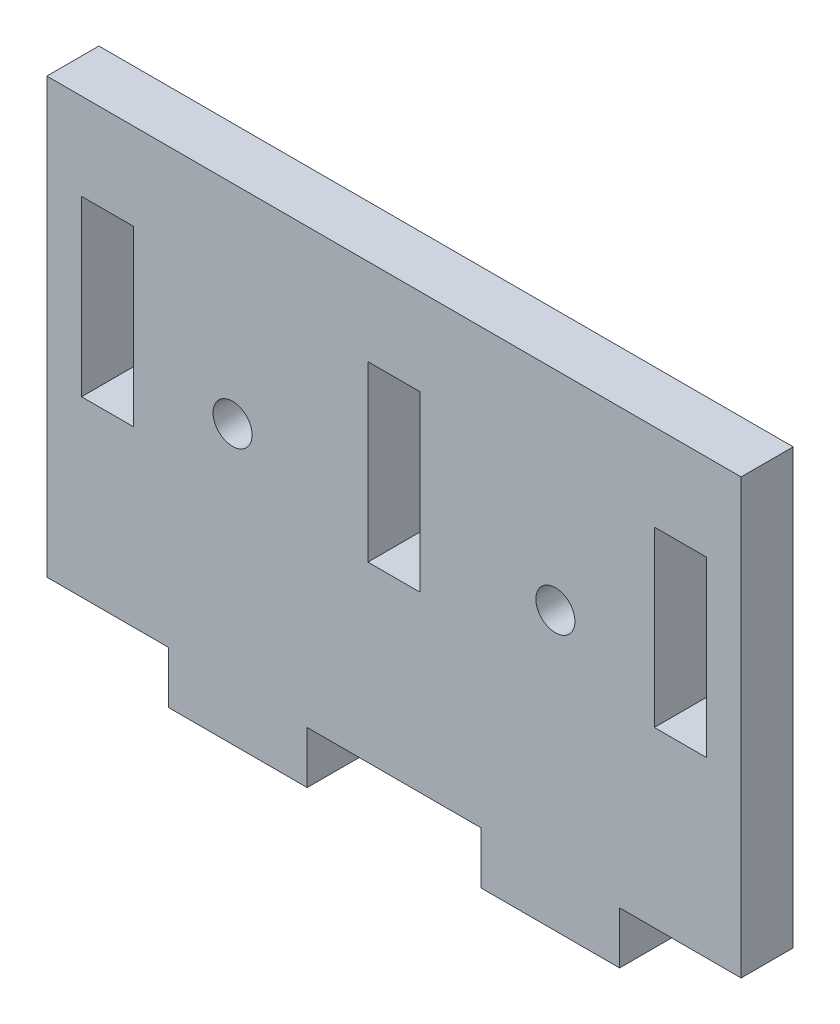
ISO-10303-21;
HEADER;
FILE_DESCRIPTION(('STEP AP214'),'2;1');
FILE_NAME('part.step','',(''),(''),'','','');
FILE_SCHEMA(('AUTOMOTIVE_DESIGN { 1 0 10303 214 1 1 1 1 }'));
ENDSEC;
DATA;
#1=APPLICATION_CONTEXT('core data for automotive mechanical design processes');
#2=APPLICATION_PROTOCOL_DEFINITION('international standard','automotive_design',2000,#1);
#3=PRODUCT_CONTEXT('',#1,'mechanical');
#4=PRODUCT('Part','Part','',(#3));
#5=PRODUCT_RELATED_PRODUCT_CATEGORY('part','',(#4));
#6=PRODUCT_DEFINITION_FORMATION('','',#4);
#7=PRODUCT_DEFINITION_CONTEXT('part definition',#1,'design');
#8=PRODUCT_DEFINITION('design','',#6,#7);
#9=PRODUCT_DEFINITION_SHAPE('','',#8);
#10=(LENGTH_UNIT() NAMED_UNIT(*) SI_UNIT(.MILLI.,.METRE.));
#11=(NAMED_UNIT(*) PLANE_ANGLE_UNIT() SI_UNIT($,.RADIAN.));
#12=(NAMED_UNIT(*) SI_UNIT($,.STERADIAN.) SOLID_ANGLE_UNIT());
#13=UNCERTAINTY_MEASURE_WITH_UNIT(LENGTH_MEASURE(1.E-05),#10,'distance_accuracy_value','');
#14=(GEOMETRIC_REPRESENTATION_CONTEXT(3) GLOBAL_UNCERTAINTY_ASSIGNED_CONTEXT((#13)) GLOBAL_UNIT_ASSIGNED_CONTEXT((#10,
#11,#12)) REPRESENTATION_CONTEXT('',''));
#15=CARTESIAN_POINT('',(0.,0.,0.));
#16=DIRECTION('',(0.,0.,1.));
#17=DIRECTION('',(1.,0.,0.));
#18=AXIS2_PLACEMENT_3D('',#15,#16,#17);
#19=CARTESIAN_POINT('',(0.,1.38777878078145E-13,3.));
#20=DIRECTION('',(0.,-1.,0.));
#21=DIRECTION('',(1.,0.,0.));
#22=AXIS2_PLACEMENT_3D('',#19,#20,#21);
#23=PLANE('',#22);
#24=DIRECTION('',(-1.,0.,0.));
#25=VECTOR('',#24,1.);
#26=CARTESIAN_POINT('',(0.,1.38777878078145E-13,0.));
#27=LINE('',#26,#25);
#28=CARTESIAN_POINT('',(40.,0.,0.));
#29=VERTEX_POINT('',#28);
#30=CARTESIAN_POINT('',(33.,0.,0.));
#31=VERTEX_POINT('',#30);
#32=EDGE_CURVE('E274',#29,#31,#27,.T.);
#33=ORIENTED_EDGE('',*,*,#32,.F.);
#34=DIRECTION('',(0.,0.,-1.));
#35=VECTOR('',#34,1.);
#36=CARTESIAN_POINT('',(40.,0.,3.));
#37=LINE('',#36,#35);
#38=CARTESIAN_POINT('',(40.,0.,3.));
#39=VERTEX_POINT('',#38);
#40=EDGE_CURVE('E11',#39,#29,#37,.T.);
#41=ORIENTED_EDGE('',*,*,#40,.F.);
#42=DIRECTION('',(-1.,0.,0.));
#43=VECTOR('',#42,1.);
#44=CARTESIAN_POINT('',(0.,1.38777878078145E-13,3.));
#45=LINE('',#44,#43);
#46=CARTESIAN_POINT('',(33.,0.,3.));
#47=VERTEX_POINT('',#46);
#48=EDGE_CURVE('E496',#39,#47,#45,.T.);
#49=ORIENTED_EDGE('',*,*,#48,.T.);
#50=DIRECTION('',(0.,0.,-1.));
#51=VECTOR('',#50,1.);
#52=CARTESIAN_POINT('',(33.,0.,3.));
#53=LINE('',#52,#51);
#54=EDGE_CURVE('E55',#47,#31,#53,.T.);
#55=ORIENTED_EDGE('',*,*,#54,.T.);
#56=EDGE_LOOP('',(#33,#41,#49,#55));
#57=FACE_BOUND('',#56,.T.);
#58=ADVANCED_FACE('F36',(#57),#23,.T.);
#59=CARTESIAN_POINT('',(40.,0.,3.));
#60=DIRECTION('',(-1.,0.,0.));
#61=DIRECTION('',(0.,-1.,0.));
#62=AXIS2_PLACEMENT_3D('',#59,#60,#61);
#63=PLANE('',#62);
#64=DIRECTION('',(0.,1.,0.));
#65=VECTOR('',#64,1.);
#66=CARTESIAN_POINT('',(40.,0.,0.));
#67=LINE('',#66,#65);
#68=CARTESIAN_POINT('',(40.,25.,0.));
#69=VERTEX_POINT('',#68);
#70=EDGE_CURVE('E276',#29,#69,#67,.T.);
#71=ORIENTED_EDGE('',*,*,#70,.T.);
#72=DIRECTION('',(0.,0.,-1.));
#73=VECTOR('',#72,1.);
#74=CARTESIAN_POINT('',(40.,25.,3.));
#75=LINE('',#74,#73);
#76=CARTESIAN_POINT('',(40.,25.,3.));
#77=VERTEX_POINT('',#76);
#78=EDGE_CURVE('E46',#77,#69,#75,.T.);
#79=ORIENTED_EDGE('',*,*,#78,.F.);
#80=DIRECTION('',(0.,1.,0.));
#81=VECTOR('',#80,1.);
#82=CARTESIAN_POINT('',(40.,0.,3.));
#83=LINE('',#82,#81);
#84=EDGE_CURVE('E494',#39,#77,#83,.T.);
#85=ORIENTED_EDGE('',*,*,#84,.F.);
#86=ORIENTED_EDGE('',*,*,#40,.T.);
#87=EDGE_LOOP('',(#71,#79,#85,#86));
#88=FACE_BOUND('',#87,.T.);
#89=ADVANCED_FACE('F389',(#88),#63,.F.);
#90=CARTESIAN_POINT('',(0.,25.,3.));
#91=DIRECTION('',(0.,-1.,0.));
#92=DIRECTION('',(1.,0.,0.));
#93=AXIS2_PLACEMENT_3D('',#90,#91,#92);
#94=PLANE('',#93);
#95=DIRECTION('',(-1.,0.,0.));
#96=VECTOR('',#95,1.);
#97=CARTESIAN_POINT('',(0.,25.,0.));
#98=LINE('',#97,#96);
#99=CARTESIAN_POINT('',(0.,25.,0.));
#100=VERTEX_POINT('',#99);
#101=EDGE_CURVE('E279',#69,#100,#98,.T.);
#102=ORIENTED_EDGE('',*,*,#101,.T.);
#103=DIRECTION('',(0.,0.,-1.));
#104=VECTOR('',#103,1.);
#105=CARTESIAN_POINT('',(0.,25.,3.));
#106=LINE('',#105,#104);
#107=CARTESIAN_POINT('',(0.,25.,3.));
#108=VERTEX_POINT('',#107);
#109=EDGE_CURVE('E332',#108,#100,#106,.T.);
#110=ORIENTED_EDGE('',*,*,#109,.F.);
#111=DIRECTION('',(-1.,0.,0.));
#112=VECTOR('',#111,1.);
#113=CARTESIAN_POINT('',(0.,25.,3.));
#114=LINE('',#113,#112);
#115=EDGE_CURVE('E490',#77,#108,#114,.T.);
#116=ORIENTED_EDGE('',*,*,#115,.F.);
#117=ORIENTED_EDGE('',*,*,#78,.T.);
#118=EDGE_LOOP('',(#102,#110,#116,#117));
#119=FACE_BOUND('',#118,.T.);
#120=ADVANCED_FACE('F394',(#119),#94,.F.);
#121=CARTESIAN_POINT('',(0.,0.,3.));
#122=DIRECTION('',(1.,0.,0.));
#123=DIRECTION('',(0.,1.,0.));
#124=AXIS2_PLACEMENT_3D('',#121,#122,#123);
#125=PLANE('',#124);
#126=DIRECTION('',(0.,-1.,0.));
#127=VECTOR('',#126,1.);
#128=CARTESIAN_POINT('',(0.,0.,0.));
#129=LINE('',#128,#127);
#130=CARTESIAN_POINT('',(0.,0.,0.));
#131=VERTEX_POINT('',#130);
#132=EDGE_CURVE('E282',#100,#131,#129,.T.);
#133=ORIENTED_EDGE('',*,*,#132,.T.);
#134=DIRECTION('',(0.,0.,-1.));
#135=VECTOR('',#134,1.);
#136=CARTESIAN_POINT('',(0.,0.,3.));
#137=LINE('',#136,#135);
#138=CARTESIAN_POINT('',(0.,0.,3.));
#139=VERTEX_POINT('',#138);
#140=EDGE_CURVE('E329',#139,#131,#137,.T.);
#141=ORIENTED_EDGE('',*,*,#140,.F.);
#142=DIRECTION('',(0.,-1.,0.));
#143=VECTOR('',#142,1.);
#144=CARTESIAN_POINT('',(0.,0.,3.));
#145=LINE('',#144,#143);
#146=EDGE_CURVE('E486',#108,#139,#145,.T.);
#147=ORIENTED_EDGE('',*,*,#146,.F.);
#148=ORIENTED_EDGE('',*,*,#109,.T.);
#149=EDGE_LOOP('',(#133,#141,#147,#148));
#150=FACE_BOUND('',#149,.T.);
#151=ADVANCED_FACE('F471',(#150),#125,.F.);
#152=CARTESIAN_POINT('',(0.,0.,3.));
#153=DIRECTION('',(0.,1.,0.));
#154=DIRECTION('',(0.,0.,1.));
#155=AXIS2_PLACEMENT_3D('',#152,#153,#154);
#156=PLANE('',#155);
#157=DIRECTION('',(1.,0.,0.));
#158=VECTOR('',#157,1.);
#159=CARTESIAN_POINT('',(0.,0.,0.));
#160=LINE('',#159,#158);
#161=CARTESIAN_POINT('',(7.,0.,0.));
#162=VERTEX_POINT('',#161);
#163=EDGE_CURVE('E285',#131,#162,#160,.T.);
#164=ORIENTED_EDGE('',*,*,#163,.T.);
#165=DIRECTION('',(0.,0.,-1.));
#166=VECTOR('',#165,1.);
#167=CARTESIAN_POINT('',(7.,0.,3.));
#168=LINE('',#167,#166);
#169=CARTESIAN_POINT('',(7.,0.,3.));
#170=VERTEX_POINT('',#169);
#171=EDGE_CURVE('E326',#170,#162,#168,.T.);
#172=ORIENTED_EDGE('',*,*,#171,.F.);
#173=DIRECTION('',(1.,0.,0.));
#174=VECTOR('',#173,1.);
#175=CARTESIAN_POINT('',(0.,0.,3.));
#176=LINE('',#175,#174);
#177=EDGE_CURVE('E489',#139,#170,#176,.T.);
#178=ORIENTED_EDGE('',*,*,#177,.F.);
#179=ORIENTED_EDGE('',*,*,#140,.T.);
#180=EDGE_LOOP('',(#164,#172,#178,#179));
#181=FACE_BOUND('',#180,.T.);
#182=ADVANCED_FACE('F467',(#181),#156,.F.);
#183=CARTESIAN_POINT('',(7.,0.,3.));
#184=DIRECTION('',(1.,0.,0.));
#185=DIRECTION('',(0.,0.,-1.));
#186=AXIS2_PLACEMENT_3D('',#183,#184,#185);
#187=PLANE('',#186);
#188=DIRECTION('',(0.,-1.,0.));
#189=VECTOR('',#188,1.);
#190=CARTESIAN_POINT('',(7.,0.,0.));
#191=LINE('',#190,#189);
#192=CARTESIAN_POINT('',(7.,-3.,0.));
#193=VERTEX_POINT('',#192);
#194=EDGE_CURVE('E288',#162,#193,#191,.T.);
#195=ORIENTED_EDGE('',*,*,#194,.T.);
#196=DIRECTION('',(0.,0.,-1.));
#197=VECTOR('',#196,1.);
#198=CARTESIAN_POINT('',(7.,-3.,3.));
#199=LINE('',#198,#197);
#200=CARTESIAN_POINT('',(7.,-3.,3.));
#201=VERTEX_POINT('',#200);
#202=EDGE_CURVE('E323',#201,#193,#199,.T.);
#203=ORIENTED_EDGE('',*,*,#202,.F.);
#204=DIRECTION('',(0.,-1.,0.));
#205=VECTOR('',#204,1.);
#206=CARTESIAN_POINT('',(7.,0.,3.));
#207=LINE('',#206,#205);
#208=EDGE_CURVE('E501',#170,#201,#207,.T.);
#209=ORIENTED_EDGE('',*,*,#208,.F.);
#210=ORIENTED_EDGE('',*,*,#171,.T.);
#211=EDGE_LOOP('',(#195,#203,#209,#210));
#212=FACE_BOUND('',#211,.T.);
#213=ADVANCED_FACE('F463',(#212),#187,.F.);
#214=CARTESIAN_POINT('',(0.,-3.,3.));
#215=DIRECTION('',(0.,1.,0.));
#216=DIRECTION('',(0.,0.,1.));
#217=AXIS2_PLACEMENT_3D('',#214,#215,#216);
#218=PLANE('',#217);
#219=DIRECTION('',(1.,0.,0.));
#220=VECTOR('',#219,1.);
#221=CARTESIAN_POINT('',(0.,-3.,0.));
#222=LINE('',#221,#220);
#223=CARTESIAN_POINT('',(15.,-3.,0.));
#224=VERTEX_POINT('',#223);
#225=EDGE_CURVE('E291',#193,#224,#222,.T.);
#226=ORIENTED_EDGE('',*,*,#225,.T.);
#227=DIRECTION('',(0.,0.,-1.));
#228=VECTOR('',#227,1.);
#229=CARTESIAN_POINT('',(15.,-3.,3.));
#230=LINE('',#229,#228);
#231=CARTESIAN_POINT('',(15.,-3.,3.));
#232=VERTEX_POINT('',#231);
#233=EDGE_CURVE('E320',#232,#224,#230,.T.);
#234=ORIENTED_EDGE('',*,*,#233,.F.);
#235=DIRECTION('',(1.,0.,0.));
#236=VECTOR('',#235,1.);
#237=CARTESIAN_POINT('',(0.,-3.,3.));
#238=LINE('',#237,#236);
#239=EDGE_CURVE('E504',#201,#232,#238,.T.);
#240=ORIENTED_EDGE('',*,*,#239,.F.);
#241=ORIENTED_EDGE('',*,*,#202,.T.);
#242=EDGE_LOOP('',(#226,#234,#240,#241));
#243=FACE_BOUND('',#242,.T.);
#244=ADVANCED_FACE('F459',(#243),#218,.F.);
#245=CARTESIAN_POINT('',(15.,0.,3.));
#246=DIRECTION('',(-1.,0.,0.));
#247=DIRECTION('',(0.,0.,1.));
#248=AXIS2_PLACEMENT_3D('',#245,#246,#247);
#249=PLANE('',#248);
#250=DIRECTION('',(0.,1.,0.));
#251=VECTOR('',#250,1.);
#252=CARTESIAN_POINT('',(15.,0.,0.));
#253=LINE('',#252,#251);
#254=CARTESIAN_POINT('',(15.,0.,0.));
#255=VERTEX_POINT('',#254);
#256=EDGE_CURVE('E294',#224,#255,#253,.T.);
#257=ORIENTED_EDGE('',*,*,#256,.T.);
#258=DIRECTION('',(0.,0.,-1.));
#259=VECTOR('',#258,1.);
#260=CARTESIAN_POINT('',(15.,0.,3.));
#261=LINE('',#260,#259);
#262=CARTESIAN_POINT('',(15.,0.,3.));
#263=VERTEX_POINT('',#262);
#264=EDGE_CURVE('E317',#263,#255,#261,.T.);
#265=ORIENTED_EDGE('',*,*,#264,.F.);
#266=DIRECTION('',(0.,1.,0.));
#267=VECTOR('',#266,1.);
#268=CARTESIAN_POINT('',(15.,0.,3.));
#269=LINE('',#268,#267);
#270=EDGE_CURVE('E507',#232,#263,#269,.T.);
#271=ORIENTED_EDGE('',*,*,#270,.F.);
#272=ORIENTED_EDGE('',*,*,#233,.T.);
#273=EDGE_LOOP('',(#257,#265,#271,#272));
#274=FACE_BOUND('',#273,.T.);
#275=ADVANCED_FACE('F455',(#274),#249,.F.);
#276=CARTESIAN_POINT('',(0.,0.,3.));
#277=DIRECTION('',(0.,1.,0.));
#278=DIRECTION('',(-1.,0.,0.));
#279=AXIS2_PLACEMENT_3D('',#276,#277,#278);
#280=PLANE('',#279);
#281=DIRECTION('',(1.,0.,0.));
#282=VECTOR('',#281,1.);
#283=CARTESIAN_POINT('',(0.,0.,0.));
#284=LINE('',#283,#282);
#285=CARTESIAN_POINT('',(25.,0.,0.));
#286=VERTEX_POINT('',#285);
#287=EDGE_CURVE('E297',#255,#286,#284,.T.);
#288=ORIENTED_EDGE('',*,*,#287,.T.);
#289=DIRECTION('',(0.,0.,-1.));
#290=VECTOR('',#289,1.);
#291=CARTESIAN_POINT('',(25.,0.,3.));
#292=LINE('',#291,#290);
#293=CARTESIAN_POINT('',(25.,0.,3.));
#294=VERTEX_POINT('',#293);
#295=EDGE_CURVE('E213',#294,#286,#292,.T.);
#296=ORIENTED_EDGE('',*,*,#295,.F.);
#297=DIRECTION('',(1.,0.,0.));
#298=VECTOR('',#297,1.);
#299=CARTESIAN_POINT('',(0.,0.,3.));
#300=LINE('',#299,#298);
#301=EDGE_CURVE('E223',#263,#294,#300,.T.);
#302=ORIENTED_EDGE('',*,*,#301,.F.);
#303=ORIENTED_EDGE('',*,*,#264,.T.);
#304=EDGE_LOOP('',(#288,#296,#302,#303));
#305=FACE_BOUND('',#304,.T.);
#306=ADVANCED_FACE('F452',(#305),#280,.F.);
#307=CARTESIAN_POINT('',(25.,0.,3.));
#308=DIRECTION('',(-1.,0.,0.));
#309=DIRECTION('',(0.,0.,1.));
#310=AXIS2_PLACEMENT_3D('',#307,#308,#309);
#311=PLANE('',#310);
#312=DIRECTION('',(0.,1.,0.));
#313=VECTOR('',#312,1.);
#314=CARTESIAN_POINT('',(25.,0.,0.));
#315=LINE('',#314,#313);
#316=CARTESIAN_POINT('',(25.,-2.99999999999997,0.));
#317=VERTEX_POINT('',#316);
#318=EDGE_CURVE('E209',#317,#286,#315,.T.);
#319=ORIENTED_EDGE('',*,*,#318,.F.);
#320=DIRECTION('',(0.,0.,-1.));
#321=VECTOR('',#320,1.);
#322=CARTESIAN_POINT('',(25.,-2.99999999999997,3.));
#323=LINE('',#322,#321);
#324=CARTESIAN_POINT('',(25.,-2.99999999999997,3.));
#325=VERTEX_POINT('',#324);
#326=EDGE_CURVE('E204',#325,#317,#323,.T.);
#327=ORIENTED_EDGE('',*,*,#326,.F.);
#328=DIRECTION('',(0.,1.,0.));
#329=VECTOR('',#328,1.);
#330=CARTESIAN_POINT('',(25.,0.,3.));
#331=LINE('',#330,#329);
#332=EDGE_CURVE('E207',#325,#294,#331,.T.);
#333=ORIENTED_EDGE('',*,*,#332,.T.);
#334=ORIENTED_EDGE('',*,*,#295,.T.);
#335=EDGE_LOOP('',(#319,#327,#333,#334));
#336=FACE_BOUND('',#335,.T.);
#337=ADVANCED_FACE('F206',(#336),#311,.T.);
#338=CARTESIAN_POINT('',(0.,-2.99999999999997,3.));
#339=DIRECTION('',(0.,-1.,0.));
#340=DIRECTION('',(0.,0.,-1.));
#341=AXIS2_PLACEMENT_3D('',#338,#339,#340);
#342=PLANE('',#341);
#343=DIRECTION('',(-1.,0.,0.));
#344=VECTOR('',#343,1.);
#345=CARTESIAN_POINT('',(0.,-2.99999999999997,0.));
#346=LINE('',#345,#344);
#347=CARTESIAN_POINT('',(33.,-2.99999999999997,0.));
#348=VERTEX_POINT('',#347);
#349=EDGE_CURVE('E301',#348,#317,#346,.T.);
#350=ORIENTED_EDGE('',*,*,#349,.F.);
#351=DIRECTION('',(0.,0.,-1.));
#352=VECTOR('',#351,1.);
#353=CARTESIAN_POINT('',(33.,-2.99999999999997,3.));
#354=LINE('',#353,#352);
#355=CARTESIAN_POINT('',(33.,-2.99999999999997,3.));
#356=VERTEX_POINT('',#355);
#357=EDGE_CURVE('E128',#356,#348,#354,.T.);
#358=ORIENTED_EDGE('',*,*,#357,.F.);
#359=DIRECTION('',(-1.,0.,0.));
#360=VECTOR('',#359,1.);
#361=CARTESIAN_POINT('',(0.,-2.99999999999997,3.));
#362=LINE('',#361,#360);
#363=EDGE_CURVE('E221',#356,#325,#362,.T.);
#364=ORIENTED_EDGE('',*,*,#363,.T.);
#365=ORIENTED_EDGE('',*,*,#326,.T.);
#366=EDGE_LOOP('',(#350,#358,#364,#365));
#367=FACE_BOUND('',#366,.T.);
#368=ADVANCED_FACE('F226',(#367),#342,.T.);
#369=CARTESIAN_POINT('',(0.,20.,3.));
#370=DIRECTION('',(0.,1.,0.));
#371=DIRECTION('',(-1.,0.,0.));
#372=AXIS2_PLACEMENT_3D('',#369,#370,#371);
#373=PLANE('',#372);
#374=DIRECTION('',(1.,0.,0.));
#375=VECTOR('',#374,1.);
#376=CARTESIAN_POINT('',(0.,20.,0.));
#377=LINE('',#376,#375);
#378=CARTESIAN_POINT('',(2.,20.,0.));
#379=VERTEX_POINT('',#378);
#380=CARTESIAN_POINT('',(5.,20.,0.));
#381=VERTEX_POINT('',#380);
#382=EDGE_CURVE('E263',#379,#381,#377,.T.);
#383=ORIENTED_EDGE('',*,*,#382,.T.);
#384=DIRECTION('',(0.,0.,-1.));
#385=VECTOR('',#384,1.);
#386=CARTESIAN_POINT('',(5.,20.,3.));
#387=LINE('',#386,#385);
#388=CARTESIAN_POINT('',(5.,20.,3.));
#389=VERTEX_POINT('',#388);
#390=EDGE_CURVE('E314',#389,#381,#387,.T.);
#391=ORIENTED_EDGE('',*,*,#390,.F.);
#392=DIRECTION('',(1.,0.,0.));
#393=VECTOR('',#392,1.);
#394=CARTESIAN_POINT('',(0.,20.,3.));
#395=LINE('',#394,#393);
#396=CARTESIAN_POINT('',(2.,20.,3.));
#397=VERTEX_POINT('',#396);
#398=EDGE_CURVE('E518',#397,#389,#395,.T.);
#399=ORIENTED_EDGE('',*,*,#398,.F.);
#400=DIRECTION('',(0.,0.,-1.));
#401=VECTOR('',#400,1.);
#402=CARTESIAN_POINT('',(2.,20.,3.));
#403=LINE('',#402,#401);
#404=EDGE_CURVE('E337',#397,#379,#403,.T.);
#405=ORIENTED_EDGE('',*,*,#404,.T.);
#406=EDGE_LOOP('',(#383,#391,#399,#405));
#407=FACE_BOUND('',#406,.T.);
#408=ADVANCED_FACE('F412',(#407),#373,.F.);
#409=CARTESIAN_POINT('',(5.,0.,3.));
#410=DIRECTION('',(1.,0.,0.));
#411=DIRECTION('',(0.,0.,-1.));
#412=AXIS2_PLACEMENT_3D('',#409,#410,#411);
#413=PLANE('',#412);
#414=DIRECTION('',(0.,-1.,0.));
#415=VECTOR('',#414,1.);
#416=CARTESIAN_POINT('',(5.,0.,0.));
#417=LINE('',#416,#415);
#418=CARTESIAN_POINT('',(5.,10.,0.));
#419=VERTEX_POINT('',#418);
#420=EDGE_CURVE('E266',#381,#419,#417,.T.);
#421=ORIENTED_EDGE('',*,*,#420,.T.);
#422=DIRECTION('',(0.,0.,-1.));
#423=VECTOR('',#422,1.);
#424=CARTESIAN_POINT('',(5.,10.,3.));
#425=LINE('',#424,#423);
#426=CARTESIAN_POINT('',(5.,10.,3.));
#427=VERTEX_POINT('',#426);
#428=EDGE_CURVE('E343',#427,#419,#425,.T.);
#429=ORIENTED_EDGE('',*,*,#428,.F.);
#430=DIRECTION('',(0.,-1.,0.));
#431=VECTOR('',#430,1.);
#432=CARTESIAN_POINT('',(5.,0.,3.));
#433=LINE('',#432,#431);
#434=EDGE_CURVE('E516',#389,#427,#433,.T.);
#435=ORIENTED_EDGE('',*,*,#434,.F.);
#436=ORIENTED_EDGE('',*,*,#390,.T.);
#437=EDGE_LOOP('',(#421,#429,#435,#436));
#438=FACE_BOUND('',#437,.T.);
#439=ADVANCED_FACE('F408',(#438),#413,.F.);
#440=CARTESIAN_POINT('',(0.,10.,3.));
#441=DIRECTION('',(0.,1.,0.));
#442=DIRECTION('',(-1.,0.,0.));
#443=AXIS2_PLACEMENT_3D('',#440,#441,#442);
#444=PLANE('',#443);
#445=DIRECTION('',(1.,0.,0.));
#446=VECTOR('',#445,1.);
#447=CARTESIAN_POINT('',(0.,10.,0.));
#448=LINE('',#447,#446);
#449=CARTESIAN_POINT('',(2.,10.,0.));
#450=VERTEX_POINT('',#449);
#451=EDGE_CURVE('E269',#450,#419,#448,.T.);
#452=ORIENTED_EDGE('',*,*,#451,.F.);
#453=DIRECTION('',(0.,0.,-1.));
#454=VECTOR('',#453,1.);
#455=CARTESIAN_POINT('',(2.,10.,3.));
#456=LINE('',#455,#454);
#457=CARTESIAN_POINT('',(2.,10.,3.));
#458=VERTEX_POINT('',#457);
#459=EDGE_CURVE('E340',#458,#450,#456,.T.);
#460=ORIENTED_EDGE('',*,*,#459,.F.);
#461=DIRECTION('',(1.,0.,0.));
#462=VECTOR('',#461,1.);
#463=CARTESIAN_POINT('',(0.,10.,3.));
#464=LINE('',#463,#462);
#465=EDGE_CURVE('E511',#458,#427,#464,.T.);
#466=ORIENTED_EDGE('',*,*,#465,.T.);
#467=ORIENTED_EDGE('',*,*,#428,.T.);
#468=EDGE_LOOP('',(#452,#460,#466,#467));
#469=FACE_BOUND('',#468,.T.);
#470=ADVANCED_FACE('F404',(#469),#444,.T.);
#471=CARTESIAN_POINT('',(38.,0.,3.));
#472=DIRECTION('',(-1.,0.,0.));
#473=DIRECTION('',(0.,0.,1.));
#474=AXIS2_PLACEMENT_3D('',#471,#472,#473);
#475=PLANE('',#474);
#476=DIRECTION('',(0.,1.,0.));
#477=VECTOR('',#476,1.);
#478=CARTESIAN_POINT('',(38.,0.,0.));
#479=LINE('',#478,#477);
#480=CARTESIAN_POINT('',(38.,10.,0.));
#481=VERTEX_POINT('',#480);
#482=CARTESIAN_POINT('',(38.,20.,0.));
#483=VERTEX_POINT('',#482);
#484=EDGE_CURVE('E251',#481,#483,#479,.T.);
#485=ORIENTED_EDGE('',*,*,#484,.F.);
#486=DIRECTION('',(0.,0.,-1.));
#487=VECTOR('',#486,1.);
#488=CARTESIAN_POINT('',(38.,10.,3.));
#489=LINE('',#488,#487);
#490=CARTESIAN_POINT('',(38.,10.,3.));
#491=VERTEX_POINT('',#490);
#492=EDGE_CURVE('E341',#491,#481,#489,.T.);
#493=ORIENTED_EDGE('',*,*,#492,.F.);
#494=DIRECTION('',(0.,1.,0.));
#495=VECTOR('',#494,1.);
#496=CARTESIAN_POINT('',(38.,0.,3.));
#497=LINE('',#496,#495);
#498=CARTESIAN_POINT('',(38.,20.,3.));
#499=VERTEX_POINT('',#498);
#500=EDGE_CURVE('E529',#491,#499,#497,.T.);
#501=ORIENTED_EDGE('',*,*,#500,.T.);
#502=DIRECTION('',(0.,0.,-1.));
#503=VECTOR('',#502,1.);
#504=CARTESIAN_POINT('',(38.,20.,3.));
#505=LINE('',#504,#503);
#506=EDGE_CURVE('E347',#499,#483,#505,.T.);
#507=ORIENTED_EDGE('',*,*,#506,.T.);
#508=EDGE_LOOP('',(#485,#493,#501,#507));
#509=FACE_BOUND('',#508,.T.);
#510=ADVANCED_FACE('F407',(#509),#475,.T.);
#511=CARTESIAN_POINT('',(0.,9.99999999999997,3.));
#512=DIRECTION('',(0.,-1.,0.));
#513=DIRECTION('',(1.,0.,0.));
#514=AXIS2_PLACEMENT_3D('',#511,#512,#513);
#515=PLANE('',#514);
#516=DIRECTION('',(-1.,0.,0.));
#517=VECTOR('',#516,1.);
#518=CARTESIAN_POINT('',(0.,9.99999999999997,0.));
#519=LINE('',#518,#517);
#520=CARTESIAN_POINT('',(35.,10.,0.));
#521=VERTEX_POINT('',#520);
#522=EDGE_CURVE('E254',#481,#521,#519,.T.);
#523=ORIENTED_EDGE('',*,*,#522,.T.);
#524=DIRECTION('',(0.,0.,-1.));
#525=VECTOR('',#524,1.);
#526=CARTESIAN_POINT('',(35.,10.,3.));
#527=LINE('',#526,#525);
#528=CARTESIAN_POINT('',(35.,10.,3.));
#529=VERTEX_POINT('',#528);
#530=EDGE_CURVE('E351',#529,#521,#527,.T.);
#531=ORIENTED_EDGE('',*,*,#530,.F.);
#532=DIRECTION('',(-1.,0.,0.));
#533=VECTOR('',#532,1.);
#534=CARTESIAN_POINT('',(0.,9.99999999999997,3.));
#535=LINE('',#534,#533);
#536=EDGE_CURVE('E527',#491,#529,#535,.T.);
#537=ORIENTED_EDGE('',*,*,#536,.F.);
#538=ORIENTED_EDGE('',*,*,#492,.T.);
#539=EDGE_LOOP('',(#523,#531,#537,#538));
#540=FACE_BOUND('',#539,.T.);
#541=ADVANCED_FACE('F423',(#540),#515,.F.);
#542=CARTESIAN_POINT('',(35.,0.,3.));
#543=DIRECTION('',(1.,0.,0.));
#544=DIRECTION('',(0.,0.,-1.));
#545=AXIS2_PLACEMENT_3D('',#542,#543,#544);
#546=PLANE('',#545);
#547=DIRECTION('',(0.,-1.,0.));
#548=VECTOR('',#547,1.);
#549=CARTESIAN_POINT('',(35.,0.,0.));
#550=LINE('',#549,#548);
#551=CARTESIAN_POINT('',(35.,20.,0.));
#552=VERTEX_POINT('',#551);
#553=EDGE_CURVE('E257',#552,#521,#550,.T.);
#554=ORIENTED_EDGE('',*,*,#553,.F.);
#555=DIRECTION('',(0.,0.,-1.));
#556=VECTOR('',#555,1.);
#557=CARTESIAN_POINT('',(35.,20.,3.));
#558=LINE('',#557,#556);
#559=CARTESIAN_POINT('',(35.,20.,3.));
#560=VERTEX_POINT('',#559);
#561=EDGE_CURVE('E349',#560,#552,#558,.T.);
#562=ORIENTED_EDGE('',*,*,#561,.F.);
#563=DIRECTION('',(0.,-1.,0.));
#564=VECTOR('',#563,1.);
#565=CARTESIAN_POINT('',(35.,0.,3.));
#566=LINE('',#565,#564);
#567=EDGE_CURVE('E524',#560,#529,#566,.T.);
#568=ORIENTED_EDGE('',*,*,#567,.T.);
#569=ORIENTED_EDGE('',*,*,#530,.T.);
#570=EDGE_LOOP('',(#554,#562,#568,#569));
#571=FACE_BOUND('',#570,.T.);
#572=ADVANCED_FACE('F420',(#571),#546,.T.);
#573=CARTESIAN_POINT('',(0.,19.9999999999999,3.));
#574=DIRECTION('',(0.,-1.,0.));
#575=DIRECTION('',(1.,0.,0.));
#576=AXIS2_PLACEMENT_3D('',#573,#574,#575);
#577=PLANE('',#576);
#578=DIRECTION('',(-1.,0.,0.));
#579=VECTOR('',#578,1.);
#580=CARTESIAN_POINT('',(0.,19.9999999999999,0.));
#581=LINE('',#580,#579);
#582=CARTESIAN_POINT('',(21.5,20.,0.));
#583=VERTEX_POINT('',#582);
#584=CARTESIAN_POINT('',(18.5,20.,0.));
#585=VERTEX_POINT('',#584);
#586=EDGE_CURVE('E239',#583,#585,#581,.T.);
#587=ORIENTED_EDGE('',*,*,#586,.F.);
#588=DIRECTION('',(0.,0.,-1.));
#589=VECTOR('',#588,1.);
#590=CARTESIAN_POINT('',(21.5,20.,3.));
#591=LINE('',#590,#589);
#592=CARTESIAN_POINT('',(21.5,20.,3.));
#593=VERTEX_POINT('',#592);
#594=EDGE_CURVE('E40',#593,#583,#591,.T.);
#595=ORIENTED_EDGE('',*,*,#594,.F.);
#596=DIRECTION('',(-1.,0.,0.));
#597=VECTOR('',#596,1.);
#598=CARTESIAN_POINT('',(0.,19.9999999999999,3.));
#599=LINE('',#598,#597);
#600=CARTESIAN_POINT('',(18.5,20.,3.));
#601=VERTEX_POINT('',#600);
#602=EDGE_CURVE('E312',#593,#601,#599,.T.);
#603=ORIENTED_EDGE('',*,*,#602,.T.);
#604=DIRECTION('',(0.,0.,-1.));
#605=VECTOR('',#604,1.);
#606=CARTESIAN_POINT('',(18.5,20.,3.));
#607=LINE('',#606,#605);
#608=EDGE_CURVE('E238',#601,#585,#607,.T.);
#609=ORIENTED_EDGE('',*,*,#608,.T.);
#610=EDGE_LOOP('',(#587,#595,#603,#609));
#611=FACE_BOUND('',#610,.T.);
#612=ADVANCED_FACE('F38',(#611),#577,.T.);
#613=CARTESIAN_POINT('',(21.5,0.,3.));
#614=DIRECTION('',(1.,0.,0.));
#615=DIRECTION('',(0.,0.,-1.));
#616=AXIS2_PLACEMENT_3D('',#613,#614,#615);
#617=PLANE('',#616);
#618=DIRECTION('',(0.,-1.,0.));
#619=VECTOR('',#618,1.);
#620=CARTESIAN_POINT('',(21.5,0.,0.));
#621=LINE('',#620,#619);
#622=CARTESIAN_POINT('',(21.5,9.99999999999999,0.));
#623=VERTEX_POINT('',#622);
#624=EDGE_CURVE('E242',#583,#623,#621,.T.);
#625=ORIENTED_EDGE('',*,*,#624,.T.);
#626=DIRECTION('',(0.,0.,-1.));
#627=VECTOR('',#626,1.);
#628=CARTESIAN_POINT('',(21.5,9.99999999999999,3.));
#629=LINE('',#628,#627);
#630=CARTESIAN_POINT('',(21.5,9.99999999999999,3.));
#631=VERTEX_POINT('',#630);
#632=EDGE_CURVE('E356',#631,#623,#629,.T.);
#633=ORIENTED_EDGE('',*,*,#632,.F.);
#634=DIRECTION('',(0.,-1.,0.));
#635=VECTOR('',#634,1.);
#636=CARTESIAN_POINT('',(21.5,0.,3.));
#637=LINE('',#636,#635);
#638=EDGE_CURVE('E364',#593,#631,#637,.T.);
#639=ORIENTED_EDGE('',*,*,#638,.F.);
#640=ORIENTED_EDGE('',*,*,#594,.T.);
#641=EDGE_LOOP('',(#625,#633,#639,#640));
#642=FACE_BOUND('',#641,.T.);
#643=ADVANCED_FACE('F363',(#642),#617,.F.);
#644=CARTESIAN_POINT('',(0.,9.99999999999994,3.));
#645=DIRECTION('',(0.,1.,0.));
#646=DIRECTION('',(-1.,0.,0.));
#647=AXIS2_PLACEMENT_3D('',#644,#645,#646);
#648=PLANE('',#647);
#649=DIRECTION('',(1.,0.,0.));
#650=VECTOR('',#649,1.);
#651=CARTESIAN_POINT('',(0.,9.99999999999994,0.));
#652=LINE('',#651,#650);
#653=CARTESIAN_POINT('',(18.5,9.99999999999999,0.));
#654=VERTEX_POINT('',#653);
#655=EDGE_CURVE('E245',#654,#623,#652,.T.);
#656=ORIENTED_EDGE('',*,*,#655,.F.);
#657=DIRECTION('',(0.,0.,-1.));
#658=VECTOR('',#657,1.);
#659=CARTESIAN_POINT('',(18.5,9.99999999999999,3.));
#660=LINE('',#659,#658);
#661=CARTESIAN_POINT('',(18.5,9.99999999999999,3.));
#662=VERTEX_POINT('',#661);
#663=EDGE_CURVE('E355',#662,#654,#660,.T.);
#664=ORIENTED_EDGE('',*,*,#663,.F.);
#665=DIRECTION('',(1.,0.,0.));
#666=VECTOR('',#665,1.);
#667=CARTESIAN_POINT('',(0.,9.99999999999994,3.));
#668=LINE('',#667,#666);
#669=EDGE_CURVE('E533',#662,#631,#668,.T.);
#670=ORIENTED_EDGE('',*,*,#669,.T.);
#671=ORIENTED_EDGE('',*,*,#632,.T.);
#672=EDGE_LOOP('',(#656,#664,#670,#671));
#673=FACE_BOUND('',#672,.T.);
#674=ADVANCED_FACE('F376',(#673),#648,.T.);
#675=CARTESIAN_POINT('',(10.7,13.,3.));
#676=DIRECTION('',(0.,0.,-1.));
#677=DIRECTION('',(-1.,0.,0.));
#678=AXIS2_PLACEMENT_3D('',#675,#676,#677);
#679=CYLINDRICAL_SURFACE('',#678,1.125);
#680=CARTESIAN_POINT('',(10.7,13.,3.));
#681=DIRECTION('',(0.,0.,1.));
#682=DIRECTION('',(1.,0.,0.));
#683=AXIS2_PLACEMENT_3D('',#680,#681,#682);
#684=CIRCLE('',#683,1.125);
#685=CARTESIAN_POINT('',(11.825,13.,3.));
#686=VERTEX_POINT('',#685);
#687=EDGE_CURVE('E229',#686,#686,#684,.T.);
#688=ORIENTED_EDGE('',*,*,#687,.T.);
#689=EDGE_LOOP('',(#688));
#690=FACE_BOUND('',#689,.T.);
#691=CARTESIAN_POINT('',(10.7,13.,0.));
#692=DIRECTION('',(0.,0.,1.));
#693=DIRECTION('',(1.,0.,0.));
#694=AXIS2_PLACEMENT_3D('',#691,#692,#693);
#695=CIRCLE('',#694,1.125);
#696=CARTESIAN_POINT('',(11.825,13.,0.));
#697=VERTEX_POINT('',#696);
#698=EDGE_CURVE('E306',#697,#697,#695,.T.);
#699=ORIENTED_EDGE('',*,*,#698,.F.);
#700=EDGE_LOOP('',(#699));
#701=FACE_BOUND('',#700,.T.);
#702=ADVANCED_FACE('F378',(#690,#701),#679,.F.);
#703=CARTESIAN_POINT('',(33.,0.,3.));
#704=DIRECTION('',(1.,0.,0.));
#705=DIRECTION('',(0.,0.,-1.));
#706=AXIS2_PLACEMENT_3D('',#703,#704,#705);
#707=PLANE('',#706);
#708=DIRECTION('',(0.,-1.,0.));
#709=VECTOR('',#708,1.);
#710=CARTESIAN_POINT('',(33.,0.,0.));
#711=LINE('',#710,#709);
#712=EDGE_CURVE('E303',#31,#348,#711,.T.);
#713=ORIENTED_EDGE('',*,*,#712,.F.);
#714=ORIENTED_EDGE('',*,*,#54,.F.);
#715=DIRECTION('',(0.,-1.,0.));
#716=VECTOR('',#715,1.);
#717=CARTESIAN_POINT('',(33.,0.,3.));
#718=LINE('',#717,#716);
#719=EDGE_CURVE('E227',#47,#356,#718,.T.);
#720=ORIENTED_EDGE('',*,*,#719,.T.);
#721=ORIENTED_EDGE('',*,*,#357,.T.);
#722=EDGE_LOOP('',(#713,#714,#720,#721));
#723=FACE_BOUND('',#722,.T.);
#724=ADVANCED_FACE('F384',(#723),#707,.T.);
#725=CARTESIAN_POINT('',(2.,0.,3.));
#726=DIRECTION('',(-1.,0.,0.));
#727=DIRECTION('',(0.,-1.,0.));
#728=AXIS2_PLACEMENT_3D('',#725,#726,#727);
#729=PLANE('',#728);
#730=DIRECTION('',(0.,1.,0.));
#731=VECTOR('',#730,1.);
#732=CARTESIAN_POINT('',(2.,0.,0.));
#733=LINE('',#732,#731);
#734=EDGE_CURVE('E272',#450,#379,#733,.T.);
#735=ORIENTED_EDGE('',*,*,#734,.T.);
#736=ORIENTED_EDGE('',*,*,#404,.F.);
#737=DIRECTION('',(0.,1.,0.));
#738=VECTOR('',#737,1.);
#739=CARTESIAN_POINT('',(2.,0.,3.));
#740=LINE('',#739,#738);
#741=EDGE_CURVE('E510',#458,#397,#740,.T.);
#742=ORIENTED_EDGE('',*,*,#741,.F.);
#743=ORIENTED_EDGE('',*,*,#459,.T.);
#744=EDGE_LOOP('',(#735,#736,#742,#743));
#745=FACE_BOUND('',#744,.T.);
#746=ADVANCED_FACE('F399',(#745),#729,.F.);
#747=CARTESIAN_POINT('',(0.,20.,3.));
#748=DIRECTION('',(0.,-1.,0.));
#749=DIRECTION('',(1.,0.,0.));
#750=AXIS2_PLACEMENT_3D('',#747,#748,#749);
#751=PLANE('',#750);
#752=DIRECTION('',(-1.,0.,0.));
#753=VECTOR('',#752,1.);
#754=CARTESIAN_POINT('',(0.,20.,0.));
#755=LINE('',#754,#753);
#756=EDGE_CURVE('E260',#483,#552,#755,.T.);
#757=ORIENTED_EDGE('',*,*,#756,.F.);
#758=ORIENTED_EDGE('',*,*,#506,.F.);
#759=DIRECTION('',(-1.,0.,0.));
#760=VECTOR('',#759,1.);
#761=CARTESIAN_POINT('',(0.,20.,3.));
#762=LINE('',#761,#760);
#763=EDGE_CURVE('E521',#499,#560,#762,.T.);
#764=ORIENTED_EDGE('',*,*,#763,.T.);
#765=ORIENTED_EDGE('',*,*,#561,.T.);
#766=EDGE_LOOP('',(#757,#758,#764,#765));
#767=FACE_BOUND('',#766,.T.);
#768=ADVANCED_FACE('F402',(#767),#751,.T.);
#769=CARTESIAN_POINT('',(18.5,0.,3.));
#770=DIRECTION('',(1.,0.,0.));
#771=DIRECTION('',(0.,0.,-1.));
#772=AXIS2_PLACEMENT_3D('',#769,#770,#771);
#773=PLANE('',#772);
#774=DIRECTION('',(0.,-1.,0.));
#775=VECTOR('',#774,1.);
#776=CARTESIAN_POINT('',(18.5,0.,0.));
#777=LINE('',#776,#775);
#778=EDGE_CURVE('E248',#585,#654,#777,.T.);
#779=ORIENTED_EDGE('',*,*,#778,.F.);
#780=ORIENTED_EDGE('',*,*,#608,.F.);
#781=DIRECTION('',(0.,-1.,0.));
#782=VECTOR('',#781,1.);
#783=CARTESIAN_POINT('',(18.5,0.,3.));
#784=LINE('',#783,#782);
#785=EDGE_CURVE('E374',#601,#662,#784,.T.);
#786=ORIENTED_EDGE('',*,*,#785,.T.);
#787=ORIENTED_EDGE('',*,*,#663,.T.);
#788=EDGE_LOOP('',(#779,#780,#786,#787));
#789=FACE_BOUND('',#788,.T.);
#790=ADVANCED_FACE('F373',(#789),#773,.T.);
#791=CARTESIAN_POINT('',(29.3,13.,3.));
#792=DIRECTION('',(0.,0.,-1.));
#793=DIRECTION('',(-1.,0.,0.));
#794=AXIS2_PLACEMENT_3D('',#791,#792,#793);
#795=CYLINDRICAL_SURFACE('',#794,1.125);
#796=CARTESIAN_POINT('',(29.3,13.,3.));
#797=DIRECTION('',(0.,0.,1.));
#798=DIRECTION('',(1.,0.,0.));
#799=AXIS2_PLACEMENT_3D('',#796,#797,#798);
#800=CIRCLE('',#799,1.125);
#801=CARTESIAN_POINT('',(30.425,13.,3.));
#802=VERTEX_POINT('',#801);
#803=EDGE_CURVE('E235',#802,#802,#800,.F.);
#804=ORIENTED_EDGE('',*,*,#803,.F.);
#805=EDGE_LOOP('',(#804));
#806=FACE_BOUND('',#805,.T.);
#807=CARTESIAN_POINT('',(29.3,13.,0.));
#808=DIRECTION('',(0.,0.,1.));
#809=DIRECTION('',(1.,0.,0.));
#810=AXIS2_PLACEMENT_3D('',#807,#808,#809);
#811=CIRCLE('',#810,1.125);
#812=CARTESIAN_POINT('',(30.425,13.,0.));
#813=VERTEX_POINT('',#812);
#814=EDGE_CURVE('E309',#813,#813,#811,.F.);
#815=ORIENTED_EDGE('',*,*,#814,.T.);
#816=EDGE_LOOP('',(#815));
#817=FACE_BOUND('',#816,.T.);
#818=ADVANCED_FACE('F431',(#806,#817),#795,.F.);
#819=CARTESIAN_POINT('',(0.,0.,3.));
#820=DIRECTION('',(0.,0.,1.));
#821=DIRECTION('',(1.,0.,0.));
#822=AXIS2_PLACEMENT_3D('',#819,#820,#821);
#823=PLANE('',#822);
#824=ORIENTED_EDGE('',*,*,#602,.F.);
#825=ORIENTED_EDGE('',*,*,#638,.T.);
#826=ORIENTED_EDGE('',*,*,#669,.F.);
#827=ORIENTED_EDGE('',*,*,#785,.F.);
#828=EDGE_LOOP('',(#824,#825,#826,#827));
#829=FACE_BOUND('',#828,.T.);
#830=ORIENTED_EDGE('',*,*,#500,.F.);
#831=ORIENTED_EDGE('',*,*,#536,.T.);
#832=ORIENTED_EDGE('',*,*,#567,.F.);
#833=ORIENTED_EDGE('',*,*,#763,.F.);
#834=EDGE_LOOP('',(#830,#831,#832,#833));
#835=FACE_BOUND('',#834,.T.);
#836=ORIENTED_EDGE('',*,*,#398,.T.);
#837=ORIENTED_EDGE('',*,*,#434,.T.);
#838=ORIENTED_EDGE('',*,*,#465,.F.);
#839=ORIENTED_EDGE('',*,*,#741,.T.);
#840=EDGE_LOOP('',(#836,#837,#838,#839));
#841=FACE_BOUND('',#840,.T.);
#842=ORIENTED_EDGE('',*,*,#48,.F.);
#843=ORIENTED_EDGE('',*,*,#84,.T.);
#844=ORIENTED_EDGE('',*,*,#115,.T.);
#845=ORIENTED_EDGE('',*,*,#146,.T.);
#846=ORIENTED_EDGE('',*,*,#177,.T.);
#847=ORIENTED_EDGE('',*,*,#208,.T.);
#848=ORIENTED_EDGE('',*,*,#239,.T.);
#849=ORIENTED_EDGE('',*,*,#270,.T.);
#850=ORIENTED_EDGE('',*,*,#301,.T.);
#851=ORIENTED_EDGE('',*,*,#332,.F.);
#852=ORIENTED_EDGE('',*,*,#363,.F.);
#853=ORIENTED_EDGE('',*,*,#719,.F.);
#854=EDGE_LOOP('',(#842,#843,#844,#845,#846,#847,#848,#849,#850,#851,#852,#853));
#855=FACE_BOUND('',#854,.T.);
#856=ORIENTED_EDGE('',*,*,#687,.F.);
#857=EDGE_LOOP('',(#856));
#858=FACE_BOUND('',#857,.T.);
#859=ORIENTED_EDGE('',*,*,#803,.T.);
#860=EDGE_LOOP('',(#859));
#861=FACE_BOUND('',#860,.T.);
#862=ADVANCED_FACE('F218',(#829,#835,#841,#855,#858,#861),#823,.T.);
#863=CARTESIAN_POINT('',(0.,0.,0.));
#864=DIRECTION('',(0.,0.,1.));
#865=DIRECTION('',(1.,0.,0.));
#866=AXIS2_PLACEMENT_3D('',#863,#864,#865);
#867=PLANE('',#866);
#868=ORIENTED_EDGE('',*,*,#586,.T.);
#869=ORIENTED_EDGE('',*,*,#778,.T.);
#870=ORIENTED_EDGE('',*,*,#655,.T.);
#871=ORIENTED_EDGE('',*,*,#624,.F.);
#872=EDGE_LOOP('',(#868,#869,#870,#871));
#873=FACE_BOUND('',#872,.T.);
#874=ORIENTED_EDGE('',*,*,#484,.T.);
#875=ORIENTED_EDGE('',*,*,#756,.T.);
#876=ORIENTED_EDGE('',*,*,#553,.T.);
#877=ORIENTED_EDGE('',*,*,#522,.F.);
#878=EDGE_LOOP('',(#874,#875,#876,#877));
#879=FACE_BOUND('',#878,.T.);
#880=ORIENTED_EDGE('',*,*,#382,.F.);
#881=ORIENTED_EDGE('',*,*,#734,.F.);
#882=ORIENTED_EDGE('',*,*,#451,.T.);
#883=ORIENTED_EDGE('',*,*,#420,.F.);
#884=EDGE_LOOP('',(#880,#881,#882,#883));
#885=FACE_BOUND('',#884,.T.);
#886=ORIENTED_EDGE('',*,*,#32,.T.);
#887=ORIENTED_EDGE('',*,*,#712,.T.);
#888=ORIENTED_EDGE('',*,*,#349,.T.);
#889=ORIENTED_EDGE('',*,*,#318,.T.);
#890=ORIENTED_EDGE('',*,*,#287,.F.);
#891=ORIENTED_EDGE('',*,*,#256,.F.);
#892=ORIENTED_EDGE('',*,*,#225,.F.);
#893=ORIENTED_EDGE('',*,*,#194,.F.);
#894=ORIENTED_EDGE('',*,*,#163,.F.);
#895=ORIENTED_EDGE('',*,*,#132,.F.);
#896=ORIENTED_EDGE('',*,*,#101,.F.);
#897=ORIENTED_EDGE('',*,*,#70,.F.);
#898=EDGE_LOOP('',(#886,#887,#888,#889,#890,#891,#892,#893,#894,#895,#896,#897));
#899=FACE_BOUND('',#898,.T.);
#900=ORIENTED_EDGE('',*,*,#698,.T.);
#901=EDGE_LOOP('',(#900));
#902=FACE_BOUND('',#901,.T.);
#903=ORIENTED_EDGE('',*,*,#814,.F.);
#904=EDGE_LOOP('',(#903));
#905=FACE_BOUND('',#904,.T.);
#906=ADVANCED_FACE('F367',(#873,#879,#885,#899,#902,#905),#867,.F.);
#907=CLOSED_SHELL('',(#58,#89,#120,#151,#182,#213,#244,#275,#306,#337,#368,#408,#439,#470,#510,
#541,#572,#612,#643,#674,#702,#724,#746,#768,#790,#818,#862,#906));
#908=MANIFOLD_SOLID_BREP('B2',#907);
#909=ADVANCED_BREP_SHAPE_REPRESENTATION('',(#18,#908),#14);
#910=SHAPE_DEFINITION_REPRESENTATION(#9,#909);
ENDSEC;
END-ISO-10303-21;
